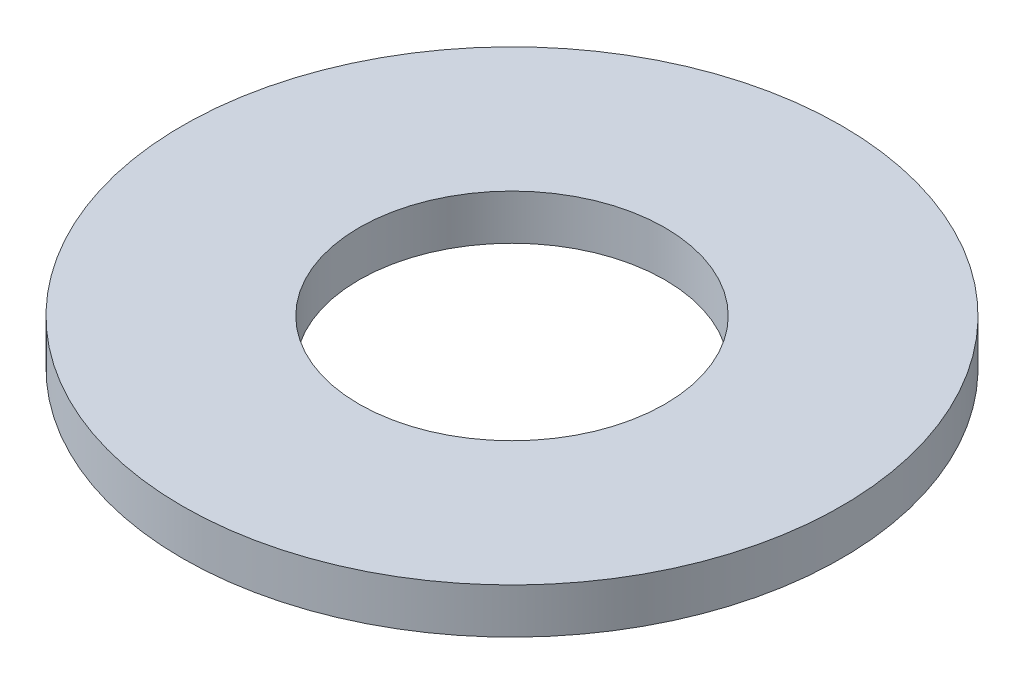
ISO-10303-21;
HEADER;
FILE_DESCRIPTION(('STEP AP214'),'2;1');
FILE_NAME('part.step','',(''),(''),'','','');
FILE_SCHEMA(('AUTOMOTIVE_DESIGN { 1 0 10303 214 1 1 1 1 }'));
ENDSEC;
DATA;
#1=APPLICATION_CONTEXT('core data for automotive mechanical design processes');
#2=APPLICATION_PROTOCOL_DEFINITION('international standard','automotive_design',2000,#1);
#3=PRODUCT_CONTEXT('',#1,'mechanical');
#4=PRODUCT('Part','Part','',(#3));
#5=PRODUCT_RELATED_PRODUCT_CATEGORY('part','',(#4));
#6=PRODUCT_DEFINITION_FORMATION('','',#4);
#7=PRODUCT_DEFINITION_CONTEXT('part definition',#1,'design');
#8=PRODUCT_DEFINITION('design','',#6,#7);
#9=PRODUCT_DEFINITION_SHAPE('','',#8);
#10=(LENGTH_UNIT() NAMED_UNIT(*) SI_UNIT(.MILLI.,.METRE.));
#11=(NAMED_UNIT(*) PLANE_ANGLE_UNIT() SI_UNIT($,.RADIAN.));
#12=(NAMED_UNIT(*) SI_UNIT($,.STERADIAN.) SOLID_ANGLE_UNIT());
#13=UNCERTAINTY_MEASURE_WITH_UNIT(LENGTH_MEASURE(1.E-05),#10,'distance_accuracy_value','');
#14=(GEOMETRIC_REPRESENTATION_CONTEXT(3) GLOBAL_UNCERTAINTY_ASSIGNED_CONTEXT((#13)) GLOBAL_UNIT_ASSIGNED_CONTEXT((#10,
#11,#12)) REPRESENTATION_CONTEXT('',''));
#15=CARTESIAN_POINT('',(0.,0.,0.));
#16=DIRECTION('',(0.,0.,1.));
#17=DIRECTION('',(1.,0.,0.));
#18=AXIS2_PLACEMENT_3D('',#15,#16,#17);
#19=CARTESIAN_POINT('',(0.,1.524,0.));
#20=DIRECTION('',(0.,-1.,0.));
#21=DIRECTION('',(0.,0.,-1.));
#22=AXIS2_PLACEMENT_3D('',#19,#20,#21);
#23=CYLINDRICAL_SURFACE('',#22,11.1125);
#24=CARTESIAN_POINT('',(0.,1.524,0.));
#25=DIRECTION('',(0.,1.,0.));
#26=DIRECTION('',(0.,0.,1.));
#27=AXIS2_PLACEMENT_3D('',#24,#25,#26);
#28=CIRCLE('',#27,11.1125);
#29=CARTESIAN_POINT('',(0.,1.524,-11.1125));
#30=VERTEX_POINT('',#29);
#31=EDGE_CURVE('E10',#30,#30,#28,.T.);
#32=CARTESIAN_POINT('',(0.,0.,0.));
#33=DIRECTION('',(0.,1.,0.));
#34=DIRECTION('',(0.,0.,1.));
#35=AXIS2_PLACEMENT_3D('',#32,#33,#34);
#36=CIRCLE('',#35,11.1125);
#37=CARTESIAN_POINT('',(0.,0.,-11.1125));
#38=VERTEX_POINT('',#37);
#39=EDGE_CURVE('E44',#38,#38,#36,.T.);
#40=CARTESIAN_POINT('',(0.,1.524,-11.1125));
#41=CARTESIAN_POINT('',(0.,1.508125,-11.1125));
#42=CARTESIAN_POINT('',(0.,1.49225,-11.1125));
#43=CARTESIAN_POINT('',(0.,1.4605,-11.1125));
#44=CARTESIAN_POINT('',(0.,1.444625,-11.1125));
#45=CARTESIAN_POINT('',(0.,1.412875,-11.1125));
#46=CARTESIAN_POINT('',(0.,1.397,-11.1125));
#47=CARTESIAN_POINT('',(0.,1.36525,-11.1125));
#48=CARTESIAN_POINT('',(0.,1.349375,-11.1125));
#49=CARTESIAN_POINT('',(0.,1.317625,-11.1125));
#50=CARTESIAN_POINT('',(0.,1.30175,-11.1125));
#51=CARTESIAN_POINT('',(0.,1.27,-11.1125));
#52=CARTESIAN_POINT('',(0.,1.254125,-11.1125));
#53=CARTESIAN_POINT('',(0.,1.222375,-11.1125));
#54=CARTESIAN_POINT('',(0.,1.2065,-11.1125));
#55=CARTESIAN_POINT('',(0.,1.17475,-11.1125));
#56=CARTESIAN_POINT('',(0.,1.158875,-11.1125));
#57=CARTESIAN_POINT('',(0.,1.127125,-11.1125));
#58=CARTESIAN_POINT('',(0.,1.11125,-11.1125));
#59=CARTESIAN_POINT('',(0.,1.0795,-11.1125));
#60=CARTESIAN_POINT('',(0.,1.063625,-11.1125));
#61=CARTESIAN_POINT('',(0.,1.031875,-11.1125));
#62=CARTESIAN_POINT('',(0.,1.016,-11.1125));
#63=CARTESIAN_POINT('',(0.,0.98425,-11.1125));
#64=CARTESIAN_POINT('',(0.,0.968375,-11.1125));
#65=CARTESIAN_POINT('',(0.,0.936625,-11.1125));
#66=CARTESIAN_POINT('',(0.,0.92075,-11.1125));
#67=CARTESIAN_POINT('',(0.,0.889,-11.1125));
#68=CARTESIAN_POINT('',(0.,0.873125,-11.1125));
#69=CARTESIAN_POINT('',(0.,0.841375,-11.1125));
#70=CARTESIAN_POINT('',(0.,0.8255,-11.1125));
#71=CARTESIAN_POINT('',(0.,0.79375,-11.1125));
#72=CARTESIAN_POINT('',(0.,0.777875,-11.1125));
#73=CARTESIAN_POINT('',(0.,0.746125,-11.1125));
#74=CARTESIAN_POINT('',(0.,0.73025,-11.1125));
#75=CARTESIAN_POINT('',(0.,0.6985,-11.1125));
#76=CARTESIAN_POINT('',(0.,0.682625,-11.1125));
#77=CARTESIAN_POINT('',(0.,0.650875,-11.1125));
#78=CARTESIAN_POINT('',(0.,0.635,-11.1125));
#79=CARTESIAN_POINT('',(0.,0.60325,-11.1125));
#80=CARTESIAN_POINT('',(0.,0.587375,-11.1125));
#81=CARTESIAN_POINT('',(0.,0.555625,-11.1125));
#82=CARTESIAN_POINT('',(0.,0.53975,-11.1125));
#83=CARTESIAN_POINT('',(0.,0.508,-11.1125));
#84=CARTESIAN_POINT('',(0.,0.492125,-11.1125));
#85=CARTESIAN_POINT('',(0.,0.460375,-11.1125));
#86=CARTESIAN_POINT('',(0.,0.4445,-11.1125));
#87=CARTESIAN_POINT('',(0.,0.41275,-11.1125));
#88=CARTESIAN_POINT('',(0.,0.396875,-11.1125));
#89=CARTESIAN_POINT('',(0.,0.365125,-11.1125));
#90=CARTESIAN_POINT('',(0.,0.34925,-11.1125));
#91=CARTESIAN_POINT('',(0.,0.3175,-11.1125));
#92=CARTESIAN_POINT('',(0.,0.301625,-11.1125));
#93=CARTESIAN_POINT('',(0.,0.269875,-11.1125));
#94=CARTESIAN_POINT('',(0.,0.254,-11.1125));
#95=CARTESIAN_POINT('',(0.,0.22225,-11.1125));
#96=CARTESIAN_POINT('',(0.,0.206375,-11.1125));
#97=CARTESIAN_POINT('',(0.,0.174625,-11.1125));
#98=CARTESIAN_POINT('',(0.,0.15875,-11.1125));
#99=CARTESIAN_POINT('',(0.,0.127,-11.1125));
#100=CARTESIAN_POINT('',(0.,0.111125,-11.1125));
#101=CARTESIAN_POINT('',(0.,0.079375,-11.1125));
#102=CARTESIAN_POINT('',(0.,0.0635,-11.1125));
#103=CARTESIAN_POINT('',(0.,0.0317499999999999,-11.1125));
#104=CARTESIAN_POINT('',(0.,0.015875,-11.1125));
#105=CARTESIAN_POINT('',(0.,0.,-11.1125));
#106=B_SPLINE_CURVE_WITH_KNOTS('',3,(#40,#41,#42,#43,#44,#45,#46,#47,#48,#49,#50,#51,#52,#53,
#54,#55,#56,#57,#58,#59,#60,#61,#62,#63,#64,#65,#66,#67,#68,#69,#70,#71,#72,#73,#74,#75,#76,#77,
#78,#79,#80,#81,#82,#83,#84,#85,#86,#87,#88,#89,#90,#91,#92,#93,#94,#95,#96,#97,#98,#99,#100,
#101,#102,#103,#104,#105),.UNSPECIFIED.,.F.,.F.,(4,2,2,2,2,2,2,2,2,2,2,2,2,2,2,2,2,2,2,2,2,2,2,
2,2,2,2,2,2,2,2,2,4),(0.,0.0476249999999999,0.0952499999999998,0.142875,0.1905,0.238125,0.28575,
0.333375,0.381,0.428625,0.47625,0.523875,0.5715,0.619125,0.66675,0.714375,0.762,0.809625,
0.85725,0.904875,0.9525,1.000125,1.04775,1.095375,1.143,1.190625,1.23825,1.285875,1.3335,
1.381125,1.42875,1.476375,1.524),.UNSPECIFIED.);
#107=EDGE_CURVE('BSEAM41',#30,#38,#106,.T.);
#108=ORIENTED_EDGE('',*,*,#31,.F.);
#109=ORIENTED_EDGE('',*,*,#39,.T.);
#110=ORIENTED_EDGE('',*,*,#107,.T.);
#111=ORIENTED_EDGE('',*,*,#107,.F.);
#112=EDGE_LOOP('',(#108,#110,#109,#111));
#113=FACE_BOUND('',#112,.T.);
#114=ADVANCED_FACE('F41',(#113),#23,.T.);
#115=CARTESIAN_POINT('',(0.,1.524,0.));
#116=DIRECTION('',(0.,1.,0.));
#117=DIRECTION('',(0.,0.,1.));
#118=AXIS2_PLACEMENT_3D('',#115,#116,#117);
#119=PLANE('',#118);
#120=CARTESIAN_POINT('',(0.,1.524,0.));
#121=DIRECTION('',(0.,1.,0.));
#122=DIRECTION('',(0.,0.,1.));
#123=AXIS2_PLACEMENT_3D('',#120,#121,#122);
#124=CIRCLE('',#123,5.1562);
#125=CARTESIAN_POINT('',(0.,1.524,5.1562));
#126=VERTEX_POINT('',#125);
#127=EDGE_CURVE('E53',#126,#126,#124,.T.);
#128=ORIENTED_EDGE('',*,*,#127,.F.);
#129=EDGE_LOOP('',(#128));
#130=FACE_BOUND('',#129,.T.);
#131=ORIENTED_EDGE('',*,*,#31,.T.);
#132=EDGE_LOOP('',(#131));
#133=FACE_BOUND('',#132,.T.);
#134=ADVANCED_FACE('F68',(#130,#133),#119,.T.);
#135=CARTESIAN_POINT('',(0.,0.,0.));
#136=DIRECTION('',(0.,1.,0.));
#137=DIRECTION('',(0.,0.,1.));
#138=AXIS2_PLACEMENT_3D('',#135,#136,#137);
#139=PLANE('',#138);
#140=CARTESIAN_POINT('',(0.,0.,0.));
#141=DIRECTION('',(0.,1.,0.));
#142=DIRECTION('',(0.,0.,1.));
#143=AXIS2_PLACEMENT_3D('',#140,#141,#142);
#144=CIRCLE('',#143,5.1562);
#145=CARTESIAN_POINT('',(0.,0.,5.1562));
#146=VERTEX_POINT('',#145);
#147=EDGE_CURVE('E51',#146,#146,#144,.T.);
#148=ORIENTED_EDGE('',*,*,#147,.T.);
#149=EDGE_LOOP('',(#148));
#150=FACE_BOUND('',#149,.T.);
#151=ORIENTED_EDGE('',*,*,#39,.F.);
#152=EDGE_LOOP('',(#151));
#153=FACE_BOUND('',#152,.T.);
#154=ADVANCED_FACE('F59',(#150,#153),#139,.F.);
#155=CARTESIAN_POINT('',(0.,0.,0.));
#156=DIRECTION('',(0.,1.,0.));
#157=DIRECTION('',(0.,0.,1.));
#158=AXIS2_PLACEMENT_3D('',#155,#156,#157);
#159=CYLINDRICAL_SURFACE('',#158,5.1562);
#160=CARTESIAN_POINT('',(0.,0.,5.1562));
#161=CARTESIAN_POINT('',(0.,0.015875,5.1562));
#162=CARTESIAN_POINT('',(0.,0.03175,5.1562));
#163=CARTESIAN_POINT('',(0.,0.0635,5.1562));
#164=CARTESIAN_POINT('',(0.,0.079375,5.1562));
#165=CARTESIAN_POINT('',(0.,0.111125,5.1562));
#166=CARTESIAN_POINT('',(0.,0.127,5.1562));
#167=CARTESIAN_POINT('',(0.,0.15875,5.1562));
#168=CARTESIAN_POINT('',(0.,0.174625,5.1562));
#169=CARTESIAN_POINT('',(0.,0.206375,5.1562));
#170=CARTESIAN_POINT('',(0.,0.22225,5.1562));
#171=CARTESIAN_POINT('',(0.,0.254,5.1562));
#172=CARTESIAN_POINT('',(0.,0.269875,5.1562));
#173=CARTESIAN_POINT('',(0.,0.301625,5.1562));
#174=CARTESIAN_POINT('',(0.,0.3175,5.1562));
#175=CARTESIAN_POINT('',(0.,0.34925,5.1562));
#176=CARTESIAN_POINT('',(0.,0.365125,5.1562));
#177=CARTESIAN_POINT('',(0.,0.396875,5.1562));
#178=CARTESIAN_POINT('',(0.,0.41275,5.1562));
#179=CARTESIAN_POINT('',(0.,0.4445,5.1562));
#180=CARTESIAN_POINT('',(0.,0.460375,5.1562));
#181=CARTESIAN_POINT('',(0.,0.492125,5.1562));
#182=CARTESIAN_POINT('',(0.,0.508,5.1562));
#183=CARTESIAN_POINT('',(0.,0.53975,5.1562));
#184=CARTESIAN_POINT('',(0.,0.555625,5.1562));
#185=CARTESIAN_POINT('',(0.,0.587375,5.1562));
#186=CARTESIAN_POINT('',(0.,0.60325,5.1562));
#187=CARTESIAN_POINT('',(0.,0.635,5.1562));
#188=CARTESIAN_POINT('',(0.,0.650875,5.1562));
#189=CARTESIAN_POINT('',(0.,0.682625,5.1562));
#190=CARTESIAN_POINT('',(0.,0.6985,5.1562));
#191=CARTESIAN_POINT('',(0.,0.73025,5.1562));
#192=CARTESIAN_POINT('',(0.,0.746125,5.1562));
#193=CARTESIAN_POINT('',(0.,0.777875,5.1562));
#194=CARTESIAN_POINT('',(0.,0.79375,5.1562));
#195=CARTESIAN_POINT('',(0.,0.8255,5.1562));
#196=CARTESIAN_POINT('',(0.,0.841375,5.1562));
#197=CARTESIAN_POINT('',(0.,0.873125,5.1562));
#198=CARTESIAN_POINT('',(0.,0.889,5.1562));
#199=CARTESIAN_POINT('',(0.,0.92075,5.1562));
#200=CARTESIAN_POINT('',(0.,0.936625,5.1562));
#201=CARTESIAN_POINT('',(0.,0.968375,5.1562));
#202=CARTESIAN_POINT('',(0.,0.98425,5.1562));
#203=CARTESIAN_POINT('',(0.,1.016,5.1562));
#204=CARTESIAN_POINT('',(0.,1.031875,5.1562));
#205=CARTESIAN_POINT('',(0.,1.063625,5.1562));
#206=CARTESIAN_POINT('',(0.,1.0795,5.1562));
#207=CARTESIAN_POINT('',(0.,1.11125,5.1562));
#208=CARTESIAN_POINT('',(0.,1.127125,5.1562));
#209=CARTESIAN_POINT('',(0.,1.158875,5.1562));
#210=CARTESIAN_POINT('',(0.,1.17475,5.1562));
#211=CARTESIAN_POINT('',(0.,1.2065,5.1562));
#212=CARTESIAN_POINT('',(0.,1.222375,5.1562));
#213=CARTESIAN_POINT('',(0.,1.254125,5.1562));
#214=CARTESIAN_POINT('',(0.,1.27,5.1562));
#215=CARTESIAN_POINT('',(0.,1.30175,5.1562));
#216=CARTESIAN_POINT('',(0.,1.317625,5.1562));
#217=CARTESIAN_POINT('',(0.,1.349375,5.1562));
#218=CARTESIAN_POINT('',(0.,1.36525,5.1562));
#219=CARTESIAN_POINT('',(0.,1.397,5.1562));
#220=CARTESIAN_POINT('',(0.,1.412875,5.1562));
#221=CARTESIAN_POINT('',(0.,1.444625,5.1562));
#222=CARTESIAN_POINT('',(0.,1.4605,5.1562));
#223=CARTESIAN_POINT('',(0.,1.49225,5.1562));
#224=CARTESIAN_POINT('',(0.,1.508125,5.1562));
#225=CARTESIAN_POINT('',(0.,1.524,5.1562));
#226=B_SPLINE_CURVE_WITH_KNOTS('',3,(#160,#161,#162,#163,#164,#165,#166,#167,#168,#169,#170,
#171,#172,#173,#174,#175,#176,#177,#178,#179,#180,#181,#182,#183,#184,#185,#186,#187,#188,#189,
#190,#191,#192,#193,#194,#195,#196,#197,#198,#199,#200,#201,#202,#203,#204,#205,#206,#207,#208,
#209,#210,#211,#212,#213,#214,#215,#216,#217,#218,#219,#220,#221,#222,#223,#224,#225),
.UNSPECIFIED.,.F.,.F.,(4,2,2,2,2,2,2,2,2,2,2,2,2,2,2,2,2,2,2,2,2,2,2,2,2,2,2,2,2,2,2,2,4),(0.,
0.047625,0.09525,0.142875,0.1905,0.238125,0.28575,0.333375,0.381,0.428625,0.47625,0.523875,
0.5715,0.619125,0.66675,0.714375,0.762,0.809625,0.85725,0.904875,0.9525,1.000125,1.04775,
1.095375,1.143,1.190625,1.23825,1.285875,1.3335,1.381125,1.42875,1.476375,1.524),.UNSPECIFIED.);
#227=EDGE_CURVE('BSEAM62',#146,#126,#226,.T.);
#228=ORIENTED_EDGE('',*,*,#147,.F.);
#229=ORIENTED_EDGE('',*,*,#127,.T.);
#230=ORIENTED_EDGE('',*,*,#227,.T.);
#231=ORIENTED_EDGE('',*,*,#227,.F.);
#232=EDGE_LOOP('',(#228,#230,#229,#231));
#233=FACE_BOUND('',#232,.T.);
#234=ADVANCED_FACE('F62',(#233),#159,.F.);
#235=CLOSED_SHELL('',(#114,#134,#154,#234));
#236=MANIFOLD_SOLID_BREP('B2',#235);
#237=ADVANCED_BREP_SHAPE_REPRESENTATION('',(#18,#236),#14);
#238=SHAPE_DEFINITION_REPRESENTATION(#9,#237);
ENDSEC;
END-ISO-10303-21;
